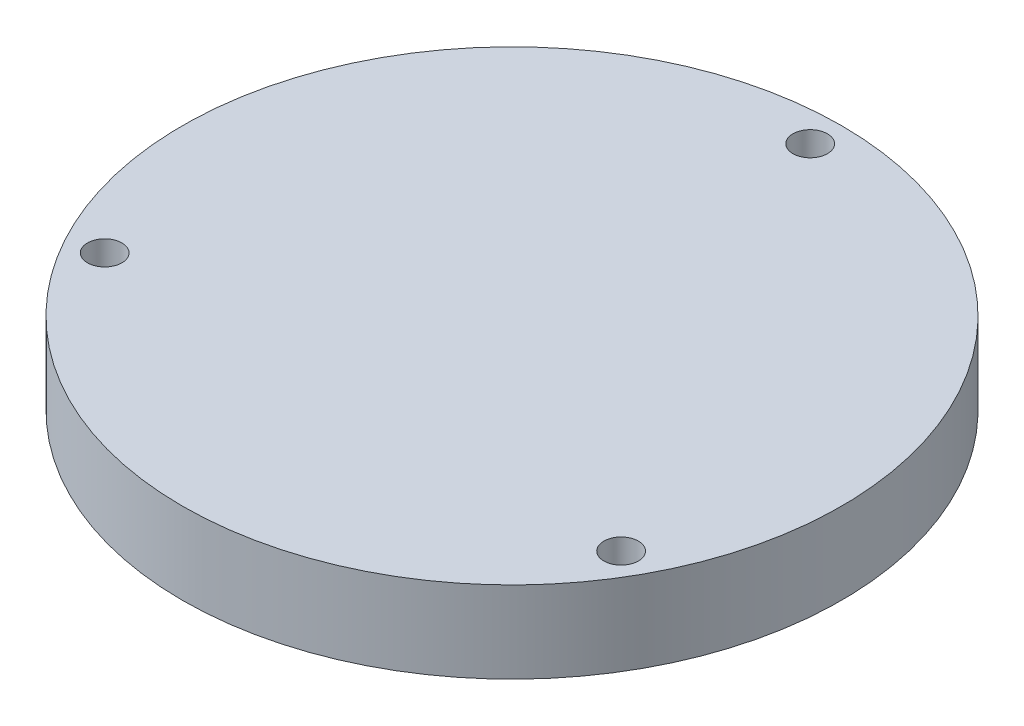
ISO-10303-21;
HEADER;
FILE_DESCRIPTION(('STEP AP214'),'2;1');
FILE_NAME('part.step','',(''),(''),'','','');
FILE_SCHEMA(('AUTOMOTIVE_DESIGN { 1 0 10303 214 1 1 1 1 }'));
ENDSEC;
DATA;
#1=APPLICATION_CONTEXT('core data for automotive mechanical design processes');
#2=APPLICATION_PROTOCOL_DEFINITION('international standard','automotive_design',2000,#1);
#3=PRODUCT_CONTEXT('',#1,'mechanical');
#4=PRODUCT('Part','Part','',(#3));
#5=PRODUCT_RELATED_PRODUCT_CATEGORY('part','',(#4));
#6=PRODUCT_DEFINITION_FORMATION('','',#4);
#7=PRODUCT_DEFINITION_CONTEXT('part definition',#1,'design');
#8=PRODUCT_DEFINITION('design','',#6,#7);
#9=PRODUCT_DEFINITION_SHAPE('','',#8);
#10=(LENGTH_UNIT() NAMED_UNIT(*) SI_UNIT(.MILLI.,.METRE.));
#11=(NAMED_UNIT(*) PLANE_ANGLE_UNIT() SI_UNIT($,.RADIAN.));
#12=(NAMED_UNIT(*) SI_UNIT($,.STERADIAN.) SOLID_ANGLE_UNIT());
#13=UNCERTAINTY_MEASURE_WITH_UNIT(LENGTH_MEASURE(1.E-05),#10,'distance_accuracy_value','');
#14=(GEOMETRIC_REPRESENTATION_CONTEXT(3) GLOBAL_UNCERTAINTY_ASSIGNED_CONTEXT((#13)) GLOBAL_UNIT_ASSIGNED_CONTEXT((#10,
#11,#12)) REPRESENTATION_CONTEXT('',''));
#15=CARTESIAN_POINT('',(0.,0.,0.));
#16=DIRECTION('',(0.,0.,1.));
#17=DIRECTION('',(1.,0.,0.));
#18=AXIS2_PLACEMENT_3D('',#15,#16,#17);
#19=CARTESIAN_POINT('',(-38.6795813318704,10.,29.2598699243729));
#20=DIRECTION('',(0.,-1.,0.));
#21=DIRECTION('',(0.,0.,-1.));
#22=AXIS2_PLACEMENT_3D('',#19,#20,#21);
#23=CYLINDRICAL_SURFACE('',#22,2.);
#24=CARTESIAN_POINT('',(-38.6795813318704,0.,29.2598699243729));
#25=DIRECTION('',(0.,1.,0.));
#26=DIRECTION('',(0.,0.,1.));
#27=AXIS2_PLACEMENT_3D('',#24,#25,#26);
#28=CIRCLE('',#27,2.);
#29=CARTESIAN_POINT('',(-39.6795813318704,0.,27.5278191168041));
#30=VERTEX_POINT('',#29);
#31=CARTESIAN_POINT('',(-40.274615613597,0.,30.4664624985739));
#32=VERTEX_POINT('',#31);
#33=EDGE_CURVE('E202',#30,#32,#28,.T.);
#34=ORIENTED_EDGE('',*,*,#33,.F.);
#35=DIRECTION('',(0.,-1.,0.));
#36=VECTOR('',#35,1.);
#37=CARTESIAN_POINT('',(-39.6795813318704,10.,27.5278191168041));
#38=LINE('',#37,#36);
#39=CARTESIAN_POINT('',(-39.6795813318704,10.,27.5278191168041));
#40=VERTEX_POINT('',#39);
#41=EDGE_CURVE('E11',#40,#30,#38,.T.);
#42=ORIENTED_EDGE('',*,*,#41,.F.);
#43=CARTESIAN_POINT('',(-38.6795813318704,10.,29.2598699243729));
#44=DIRECTION('',(0.,1.,0.));
#45=DIRECTION('',(0.,0.,1.));
#46=AXIS2_PLACEMENT_3D('',#43,#44,#45);
#47=CIRCLE('',#46,2.);
#48=CARTESIAN_POINT('',(-40.274615613597,10.,30.4664624985739));
#49=VERTEX_POINT('',#48);
#50=EDGE_CURVE('E249',#40,#49,#47,.T.);
#51=ORIENTED_EDGE('',*,*,#50,.T.);
#52=DIRECTION('',(0.,-1.,0.));
#53=VECTOR('',#52,1.);
#54=CARTESIAN_POINT('',(-40.274615613597,10.,30.4664624985739));
#55=LINE('',#54,#53);
#56=EDGE_CURVE('E117',#49,#32,#55,.T.);
#57=ORIENTED_EDGE('',*,*,#56,.T.);
#58=EDGE_LOOP('',(#34,#42,#51,#57));
#59=FACE_BOUND('',#58,.T.);
#60=ADVANCED_FACE('F36',(#59),#23,.F.);
#61=CARTESIAN_POINT('',(2.00000000000007,10.,3.46410161513791));
#62=DIRECTION('',(-0.499999999999997,0.,-0.86602540378444));
#63=DIRECTION('',(-0.86602540378444,0.,0.499999999999997));
#64=AXIS2_PLACEMENT_3D('',#61,#62,#63);
#65=PLANE('',#64);
#66=DIRECTION('',(0.86602540378444,0.,-0.499999999999997));
#67=VECTOR('',#66,1.);
#68=CARTESIAN_POINT('',(2.00000000000007,0.,3.46410161513791));
#69=LINE('',#68,#67);
#70=CARTESIAN_POINT('',(-39.1362066797609,0.,27.2141016151376));
#71=VERTEX_POINT('',#70);
#72=EDGE_CURVE('E205',#30,#71,#69,.T.);
#73=ORIENTED_EDGE('',*,*,#72,.T.);
#74=DIRECTION('',(0.,-1.,0.));
#75=VECTOR('',#74,1.);
#76=CARTESIAN_POINT('',(-39.1362066797609,10.,27.2141016151376));
#77=LINE('',#76,#75);
#78=CARTESIAN_POINT('',(-39.1362066797609,10.,27.2141016151376));
#79=VERTEX_POINT('',#78);
#80=EDGE_CURVE('E45',#79,#71,#77,.T.);
#81=ORIENTED_EDGE('',*,*,#80,.F.);
#82=DIRECTION('',(0.86602540378444,0.,-0.499999999999997));
#83=VECTOR('',#82,1.);
#84=CARTESIAN_POINT('',(2.00000000000007,10.,3.46410161513791));
#85=LINE('',#84,#83);
#86=EDGE_CURVE('E306',#40,#79,#85,.T.);
#87=ORIENTED_EDGE('',*,*,#86,.F.);
#88=ORIENTED_EDGE('',*,*,#41,.T.);
#89=EDGE_LOOP('',(#73,#81,#87,#88));
#90=FACE_BOUND('',#89,.T.);
#91=ADVANCED_FACE('F364',(#90),#65,.F.);
#92=CARTESIAN_POINT('',(-41.1362066797611,10.,23.7499999999996));
#93=DIRECTION('',(0.,-1.,0.));
#94=DIRECTION('',(0.,0.,-1.));
#95=AXIS2_PLACEMENT_3D('',#92,#93,#94);
#96=CYLINDRICAL_SURFACE('',#95,4.);
#97=CARTESIAN_POINT('',(-41.1362066797611,0.,23.7499999999996));
#98=DIRECTION('',(0.,1.,0.));
#99=DIRECTION('',(0.,0.,1.));
#100=AXIS2_PLACEMENT_3D('',#97,#98,#99);
#101=CIRCLE('',#100,4.);
#102=CARTESIAN_POINT('',(-43.1362066797609,0.,20.2858983848621));
#103=VERTEX_POINT('',#102);
#104=EDGE_CURVE('E208',#71,#103,#101,.T.);
#105=ORIENTED_EDGE('',*,*,#104,.T.);
#106=DIRECTION('',(0.,-1.,0.));
#107=VECTOR('',#106,1.);
#108=CARTESIAN_POINT('',(-43.1362066797609,10.,20.2858983848621));
#109=LINE('',#108,#107);
#110=CARTESIAN_POINT('',(-43.1362066797609,10.,20.2858983848621));
#111=VERTEX_POINT('',#110);
#112=EDGE_CURVE('E277',#111,#103,#109,.T.);
#113=ORIENTED_EDGE('',*,*,#112,.F.);
#114=CARTESIAN_POINT('',(-41.1362066797611,10.,23.7499999999996));
#115=DIRECTION('',(0.,1.,0.));
#116=DIRECTION('',(0.,0.,1.));
#117=AXIS2_PLACEMENT_3D('',#114,#115,#116);
#118=CIRCLE('',#117,4.);
#119=EDGE_CURVE('E309',#79,#111,#118,.T.);
#120=ORIENTED_EDGE('',*,*,#119,.F.);
#121=ORIENTED_EDGE('',*,*,#80,.T.);
#122=EDGE_LOOP('',(#105,#113,#120,#121));
#123=FACE_BOUND('',#122,.T.);
#124=ADVANCED_FACE('F368',(#123),#96,.T.);
#125=CARTESIAN_POINT('',(-1.9999999999999,10.,-3.46410161513761));
#126=DIRECTION('',(-0.499999999999997,0.,-0.86602540378444));
#127=DIRECTION('',(-0.86602540378444,0.,0.499999999999997));
#128=AXIS2_PLACEMENT_3D('',#125,#126,#127);
#129=PLANE('',#128);
#130=DIRECTION('',(0.86602540378444,0.,-0.499999999999997));
#131=VECTOR('',#130,1.);
#132=CARTESIAN_POINT('',(-1.9999999999999,0.,-3.46410161513761));
#133=LINE('',#132,#131);
#134=CARTESIAN_POINT('',(-43.6795813318704,0.,20.5996158865285));
#135=VERTEX_POINT('',#134);
#136=EDGE_CURVE('E211',#135,#103,#133,.T.);
#137=ORIENTED_EDGE('',*,*,#136,.F.);
#138=DIRECTION('',(0.,-1.,0.));
#139=VECTOR('',#138,1.);
#140=CARTESIAN_POINT('',(-43.6795813318704,10.,20.5996158865285));
#141=LINE('',#140,#139);
#142=CARTESIAN_POINT('',(-43.6795813318704,10.,20.5996158865285));
#143=VERTEX_POINT('',#142);
#144=EDGE_CURVE('E275',#143,#135,#141,.T.);
#145=ORIENTED_EDGE('',*,*,#144,.F.);
#146=DIRECTION('',(0.86602540378444,0.,-0.499999999999997));
#147=VECTOR('',#146,1.);
#148=CARTESIAN_POINT('',(-1.9999999999999,10.,-3.46410161513761));
#149=LINE('',#148,#147);
#150=EDGE_CURVE('E312',#143,#111,#149,.T.);
#151=ORIENTED_EDGE('',*,*,#150,.T.);
#152=ORIENTED_EDGE('',*,*,#112,.T.);
#153=EDGE_LOOP('',(#137,#145,#151,#152));
#154=FACE_BOUND('',#153,.T.);
#155=ADVANCED_FACE('F634',(#154),#129,.T.);
#156=CARTESIAN_POINT('',(-44.6795813318704,10.,18.8675650789597));
#157=DIRECTION('',(0.,-1.,0.));
#158=DIRECTION('',(0.,0.,-1.));
#159=AXIS2_PLACEMENT_3D('',#156,#157,#158);
#160=CYLINDRICAL_SURFACE('',#159,2.);
#161=CARTESIAN_POINT('',(-44.6795813318704,0.,18.8675650789597));
#162=DIRECTION('',(0.,1.,0.));
#163=DIRECTION('',(0.,0.,1.));
#164=AXIS2_PLACEMENT_3D('',#161,#162,#163);
#165=CIRCLE('',#164,2.);
#166=CARTESIAN_POINT('',(-46.5220382940094,0.,19.6456089997415));
#167=VERTEX_POINT('',#166);
#168=EDGE_CURVE('E214',#135,#167,#165,.F.);
#169=ORIENTED_EDGE('',*,*,#168,.T.);
#170=DIRECTION('',(0.,-1.,0.));
#171=VECTOR('',#170,1.);
#172=CARTESIAN_POINT('',(-46.5220382940094,10.,19.6456089997415));
#173=LINE('',#172,#171);
#174=CARTESIAN_POINT('',(-46.5220382940094,10.,19.6456089997415));
#175=VERTEX_POINT('',#174);
#176=EDGE_CURVE('E272',#175,#167,#173,.T.);
#177=ORIENTED_EDGE('',*,*,#176,.F.);
#178=CARTESIAN_POINT('',(-44.6795813318704,10.,18.8675650789597));
#179=DIRECTION('',(0.,1.,0.));
#180=DIRECTION('',(0.,0.,1.));
#181=AXIS2_PLACEMENT_3D('',#178,#179,#180);
#182=CIRCLE('',#181,2.);
#183=EDGE_CURVE('E315',#143,#175,#182,.F.);
#184=ORIENTED_EDGE('',*,*,#183,.F.);
#185=ORIENTED_EDGE('',*,*,#144,.T.);
#186=EDGE_LOOP('',(#169,#177,#184,#185));
#187=FACE_BOUND('',#186,.T.);
#188=ADVANCED_FACE('F623',(#187),#160,.F.);
#189=CARTESIAN_POINT('',(0.,10.,0.));
#190=DIRECTION('',(0.,-1.,0.));
#191=DIRECTION('',(0.,0.,-1.));
#192=AXIS2_PLACEMENT_3D('',#189,#190,#191);
#193=CYLINDRICAL_SURFACE('',#192,50.5);
#194=CARTESIAN_POINT('',(0.,0.,0.));
#195=DIRECTION('',(0.,1.,0.));
#196=DIRECTION('',(0.,0.,1.));
#197=AXIS2_PLACEMENT_3D('',#194,#195,#196);
#198=CIRCLE('',#197,50.5);
#199=CARTESIAN_POINT('',(-6.24742268041235,0.,-50.1120714983154));
#200=VERTEX_POINT('',#199);
#201=EDGE_CURVE('E216',#167,#200,#198,.F.);
#202=ORIENTED_EDGE('',*,*,#201,.T.);
#203=DIRECTION('',(0.,-1.,0.));
#204=VECTOR('',#203,1.);
#205=CARTESIAN_POINT('',(-6.24742268041235,10.,-50.1120714983154));
#206=LINE('',#205,#204);
#207=CARTESIAN_POINT('',(-6.24742268041235,10.,-50.1120714983154));
#208=VERTEX_POINT('',#207);
#209=EDGE_CURVE('E270',#208,#200,#206,.T.);
#210=ORIENTED_EDGE('',*,*,#209,.F.);
#211=CARTESIAN_POINT('',(0.,10.,0.));
#212=DIRECTION('',(0.,1.,0.));
#213=DIRECTION('',(0.,0.,1.));
#214=AXIS2_PLACEMENT_3D('',#211,#212,#213);
#215=CIRCLE('',#214,50.5);
#216=EDGE_CURVE('E318',#175,#208,#215,.F.);
#217=ORIENTED_EDGE('',*,*,#216,.F.);
#218=ORIENTED_EDGE('',*,*,#176,.T.);
#219=EDGE_LOOP('',(#202,#210,#217,#218));
#220=FACE_BOUND('',#219,.T.);
#221=ADVANCED_FACE('F613',(#220),#193,.F.);
#222=CARTESIAN_POINT('',(-6.,10.,-48.1274350033326));
#223=DIRECTION('',(0.,-1.,0.));
#224=DIRECTION('',(0.,0.,-1.));
#225=AXIS2_PLACEMENT_3D('',#222,#223,#224);
#226=CYLINDRICAL_SURFACE('',#225,2.);
#227=CARTESIAN_POINT('',(-6.,0.,-48.1274350033326));
#228=DIRECTION('',(0.,1.,0.));
#229=DIRECTION('',(0.,0.,1.));
#230=AXIS2_PLACEMENT_3D('',#227,#228,#229);
#231=CIRCLE('',#230,2.);
#232=CARTESIAN_POINT('',(-4.,0.,-48.1274350033326));
#233=VERTEX_POINT('',#232);
#234=EDGE_CURVE('E219',#233,#200,#231,.T.);
#235=ORIENTED_EDGE('',*,*,#234,.F.);
#236=DIRECTION('',(0.,-1.,0.));
#237=VECTOR('',#236,1.);
#238=CARTESIAN_POINT('',(-4.,10.,-48.1274350033326));
#239=LINE('',#238,#237);
#240=CARTESIAN_POINT('',(-4.,10.,-48.1274350033326));
#241=VERTEX_POINT('',#240);
#242=EDGE_CURVE('E268',#241,#233,#239,.T.);
#243=ORIENTED_EDGE('',*,*,#242,.F.);
#244=CARTESIAN_POINT('',(-6.,10.,-48.1274350033326));
#245=DIRECTION('',(0.,1.,0.));
#246=DIRECTION('',(0.,0.,1.));
#247=AXIS2_PLACEMENT_3D('',#244,#245,#246);
#248=CIRCLE('',#247,2.);
#249=EDGE_CURVE('E321',#241,#208,#248,.T.);
#250=ORIENTED_EDGE('',*,*,#249,.T.);
#251=ORIENTED_EDGE('',*,*,#209,.T.);
#252=EDGE_LOOP('',(#235,#243,#250,#251));
#253=FACE_BOUND('',#252,.T.);
#254=ADVANCED_FACE('F603',(#253),#226,.F.);
#255=CARTESIAN_POINT('',(-4.,10.,0.));
#256=DIRECTION('',(1.,0.,0.));
#257=DIRECTION('',(0.,0.,-1.));
#258=AXIS2_PLACEMENT_3D('',#255,#256,#257);
#259=PLANE('',#258);
#260=DIRECTION('',(0.,0.,1.));
#261=VECTOR('',#260,1.);
#262=CARTESIAN_POINT('',(-4.,0.,0.));
#263=LINE('',#262,#261);
#264=CARTESIAN_POINT('',(-4.,0.,-47.5));
#265=VERTEX_POINT('',#264);
#266=EDGE_CURVE('E222',#233,#265,#263,.T.);
#267=ORIENTED_EDGE('',*,*,#266,.T.);
#268=DIRECTION('',(0.,-1.,0.));
#269=VECTOR('',#268,1.);
#270=CARTESIAN_POINT('',(-4.,10.,-47.5));
#271=LINE('',#270,#269);
#272=CARTESIAN_POINT('',(-4.,10.,-47.5));
#273=VERTEX_POINT('',#272);
#274=EDGE_CURVE('E265',#273,#265,#271,.T.);
#275=ORIENTED_EDGE('',*,*,#274,.F.);
#276=DIRECTION('',(0.,0.,1.));
#277=VECTOR('',#276,1.);
#278=CARTESIAN_POINT('',(-4.,10.,0.));
#279=LINE('',#278,#277);
#280=EDGE_CURVE('E324',#241,#273,#279,.T.);
#281=ORIENTED_EDGE('',*,*,#280,.F.);
#282=ORIENTED_EDGE('',*,*,#242,.T.);
#283=EDGE_LOOP('',(#267,#275,#281,#282));
#284=FACE_BOUND('',#283,.T.);
#285=ADVANCED_FACE('F593',(#284),#259,.F.);
#286=CARTESIAN_POINT('',(0.,10.,-47.5));
#287=DIRECTION('',(0.,-1.,0.));
#288=DIRECTION('',(0.,0.,-1.));
#289=AXIS2_PLACEMENT_3D('',#286,#287,#288);
#290=CYLINDRICAL_SURFACE('',#289,4.);
#291=CARTESIAN_POINT('',(0.,0.,-47.5));
#292=DIRECTION('',(0.,1.,0.));
#293=DIRECTION('',(0.,0.,1.));
#294=AXIS2_PLACEMENT_3D('',#291,#292,#293);
#295=CIRCLE('',#294,4.);
#296=CARTESIAN_POINT('',(4.,0.,-47.5));
#297=VERTEX_POINT('',#296);
#298=EDGE_CURVE('E224',#265,#297,#295,.T.);
#299=ORIENTED_EDGE('',*,*,#298,.T.);
#300=DIRECTION('',(0.,-1.,0.));
#301=VECTOR('',#300,1.);
#302=CARTESIAN_POINT('',(4.,10.,-47.5));
#303=LINE('',#302,#301);
#304=CARTESIAN_POINT('',(4.,10.,-47.5));
#305=VERTEX_POINT('',#304);
#306=EDGE_CURVE('E263',#305,#297,#303,.T.);
#307=ORIENTED_EDGE('',*,*,#306,.F.);
#308=CARTESIAN_POINT('',(0.,10.,-47.5));
#309=DIRECTION('',(0.,1.,0.));
#310=DIRECTION('',(0.,0.,1.));
#311=AXIS2_PLACEMENT_3D('',#308,#309,#310);
#312=CIRCLE('',#311,4.);
#313=EDGE_CURVE('E327',#273,#305,#312,.T.);
#314=ORIENTED_EDGE('',*,*,#313,.F.);
#315=ORIENTED_EDGE('',*,*,#274,.T.);
#316=EDGE_LOOP('',(#299,#307,#314,#315));
#317=FACE_BOUND('',#316,.T.);
#318=ADVANCED_FACE('F583',(#317),#290,.T.);
#319=CARTESIAN_POINT('',(4.,10.,0.));
#320=DIRECTION('',(1.,0.,0.));
#321=DIRECTION('',(0.,0.,-1.));
#322=AXIS2_PLACEMENT_3D('',#319,#320,#321);
#323=PLANE('',#322);
#324=DIRECTION('',(0.,0.,1.));
#325=VECTOR('',#324,1.);
#326=CARTESIAN_POINT('',(4.,0.,0.));
#327=LINE('',#326,#325);
#328=CARTESIAN_POINT('',(4.,0.,-48.1274350033326));
#329=VERTEX_POINT('',#328);
#330=EDGE_CURVE('E227',#329,#297,#327,.T.);
#331=ORIENTED_EDGE('',*,*,#330,.F.);
#332=DIRECTION('',(0.,-1.,0.));
#333=VECTOR('',#332,1.);
#334=CARTESIAN_POINT('',(4.,10.,-48.1274350033326));
#335=LINE('',#334,#333);
#336=CARTESIAN_POINT('',(4.,10.,-48.1274350033326));
#337=VERTEX_POINT('',#336);
#338=EDGE_CURVE('E261',#337,#329,#335,.T.);
#339=ORIENTED_EDGE('',*,*,#338,.F.);
#340=DIRECTION('',(0.,0.,1.));
#341=VECTOR('',#340,1.);
#342=CARTESIAN_POINT('',(4.,10.,0.));
#343=LINE('',#342,#341);
#344=EDGE_CURVE('E330',#337,#305,#343,.T.);
#345=ORIENTED_EDGE('',*,*,#344,.T.);
#346=ORIENTED_EDGE('',*,*,#306,.T.);
#347=EDGE_LOOP('',(#331,#339,#345,#346));
#348=FACE_BOUND('',#347,.T.);
#349=ADVANCED_FACE('F573',(#348),#323,.T.);
#350=CARTESIAN_POINT('',(6.,10.,-48.1274350033326));
#351=DIRECTION('',(0.,-1.,0.));
#352=DIRECTION('',(0.,0.,-1.));
#353=AXIS2_PLACEMENT_3D('',#350,#351,#352);
#354=CYLINDRICAL_SURFACE('',#353,2.);
#355=CARTESIAN_POINT('',(6.,0.,-48.1274350033326));
#356=DIRECTION('',(0.,1.,0.));
#357=DIRECTION('',(0.,0.,1.));
#358=AXIS2_PLACEMENT_3D('',#355,#356,#357);
#359=CIRCLE('',#358,2.);
#360=CARTESIAN_POINT('',(6.24742268041237,0.,-50.1120714983154));
#361=VERTEX_POINT('',#360);
#362=EDGE_CURVE('E230',#329,#361,#359,.F.);
#363=ORIENTED_EDGE('',*,*,#362,.T.);
#364=DIRECTION('',(0.,-1.,0.));
#365=VECTOR('',#364,1.);
#366=CARTESIAN_POINT('',(6.24742268041237,10.,-50.1120714983154));
#367=LINE('',#366,#365);
#368=CARTESIAN_POINT('',(6.24742268041237,10.,-50.1120714983154));
#369=VERTEX_POINT('',#368);
#370=EDGE_CURVE('E258',#369,#361,#367,.T.);
#371=ORIENTED_EDGE('',*,*,#370,.F.);
#372=CARTESIAN_POINT('',(6.,10.,-48.1274350033326));
#373=DIRECTION('',(0.,1.,0.));
#374=DIRECTION('',(0.,0.,1.));
#375=AXIS2_PLACEMENT_3D('',#372,#373,#374);
#376=CIRCLE('',#375,2.);
#377=EDGE_CURVE('E333',#337,#369,#376,.F.);
#378=ORIENTED_EDGE('',*,*,#377,.F.);
#379=ORIENTED_EDGE('',*,*,#338,.T.);
#380=EDGE_LOOP('',(#363,#371,#378,#379));
#381=FACE_BOUND('',#380,.T.);
#382=ADVANCED_FACE('F563',(#381),#354,.F.);
#383=CARTESIAN_POINT('',(0.,10.,0.));
#384=DIRECTION('',(0.,-1.,0.));
#385=DIRECTION('',(0.,0.,-1.));
#386=AXIS2_PLACEMENT_3D('',#383,#384,#385);
#387=CYLINDRICAL_SURFACE('',#386,50.5);
#388=CARTESIAN_POINT('',(0.,0.,0.));
#389=DIRECTION('',(0.,1.,0.));
#390=DIRECTION('',(0.,0.,1.));
#391=AXIS2_PLACEMENT_3D('',#388,#389,#390);
#392=CIRCLE('',#391,50.5);
#393=CARTESIAN_POINT('',(46.5220382940094,0.,19.6456089997415));
#394=VERTEX_POINT('',#393);
#395=EDGE_CURVE('E232',#361,#394,#392,.F.);
#396=ORIENTED_EDGE('',*,*,#395,.T.);
#397=DIRECTION('',(0.,-1.,0.));
#398=VECTOR('',#397,1.);
#399=CARTESIAN_POINT('',(46.5220382940094,10.,19.6456089997415));
#400=LINE('',#399,#398);
#401=CARTESIAN_POINT('',(46.5220382940094,10.,19.6456089997415));
#402=VERTEX_POINT('',#401);
#403=EDGE_CURVE('E256',#402,#394,#400,.T.);
#404=ORIENTED_EDGE('',*,*,#403,.F.);
#405=CARTESIAN_POINT('',(0.,10.,0.));
#406=DIRECTION('',(0.,1.,0.));
#407=DIRECTION('',(0.,0.,1.));
#408=AXIS2_PLACEMENT_3D('',#405,#406,#407);
#409=CIRCLE('',#408,50.5);
#410=EDGE_CURVE('E336',#369,#402,#409,.F.);
#411=ORIENTED_EDGE('',*,*,#410,.F.);
#412=ORIENTED_EDGE('',*,*,#370,.T.);
#413=EDGE_LOOP('',(#396,#404,#411,#412));
#414=FACE_BOUND('',#413,.T.);
#415=ADVANCED_FACE('F346',(#414),#387,.F.);
#416=CARTESIAN_POINT('',(44.6795813318704,10.,18.8675650789596));
#417=DIRECTION('',(0.,-1.,0.));
#418=DIRECTION('',(0.,0.,-1.));
#419=AXIS2_PLACEMENT_3D('',#416,#417,#418);
#420=CYLINDRICAL_SURFACE('',#419,2.00000000000001);
#421=CARTESIAN_POINT('',(44.6795813318704,0.,18.8675650789596));
#422=DIRECTION('',(0.,1.,0.));
#423=DIRECTION('',(0.,0.,1.));
#424=AXIS2_PLACEMENT_3D('',#421,#422,#423);
#425=CIRCLE('',#424,2.00000000000001);
#426=CARTESIAN_POINT('',(43.6795813318704,0.,20.5996158865285));
#427=VERTEX_POINT('',#426);
#428=EDGE_CURVE('E235',#427,#394,#425,.T.);
#429=ORIENTED_EDGE('',*,*,#428,.F.);
#430=DIRECTION('',(0.,-1.,0.));
#431=VECTOR('',#430,1.);
#432=CARTESIAN_POINT('',(43.6795813318704,10.,20.5996158865285));
#433=LINE('',#432,#431);
#434=CARTESIAN_POINT('',(43.6795813318704,10.,20.5996158865285));
#435=VERTEX_POINT('',#434);
#436=EDGE_CURVE('E254',#435,#427,#433,.T.);
#437=ORIENTED_EDGE('',*,*,#436,.F.);
#438=CARTESIAN_POINT('',(44.6795813318704,10.,18.8675650789596));
#439=DIRECTION('',(0.,1.,0.));
#440=DIRECTION('',(0.,0.,1.));
#441=AXIS2_PLACEMENT_3D('',#438,#439,#440);
#442=CIRCLE('',#441,2.00000000000001);
#443=EDGE_CURVE('E194',#435,#402,#442,.T.);
#444=ORIENTED_EDGE('',*,*,#443,.T.);
#445=ORIENTED_EDGE('',*,*,#403,.T.);
#446=EDGE_LOOP('',(#429,#437,#444,#445));
#447=FACE_BOUND('',#446,.T.);
#448=ADVANCED_FACE('F341',(#447),#420,.F.);
#449=CARTESIAN_POINT('',(2.00000000000021,10.,-3.46410161513805));
#450=DIRECTION('',(-0.500000000000006,0.,0.866025403784435));
#451=DIRECTION('',(0.866025403784435,0.,0.500000000000006));
#452=AXIS2_PLACEMENT_3D('',#449,#450,#451);
#453=PLANE('',#452);
#454=DIRECTION('',(-0.866025403784435,0.,-0.500000000000006));
#455=VECTOR('',#454,1.);
#456=CARTESIAN_POINT('',(2.00000000000021,0.,-3.46410161513805));
#457=LINE('',#456,#455);
#458=CARTESIAN_POINT('',(43.1362066797608,0.,20.2858983848623));
#459=VERTEX_POINT('',#458);
#460=EDGE_CURVE('E238',#427,#459,#457,.T.);
#461=ORIENTED_EDGE('',*,*,#460,.T.);
#462=DIRECTION('',(0.,-1.,0.));
#463=VECTOR('',#462,1.);
#464=CARTESIAN_POINT('',(43.1362066797608,10.,20.2858983848623));
#465=LINE('',#464,#463);
#466=CARTESIAN_POINT('',(43.1362066797608,10.,20.2858983848623));
#467=VERTEX_POINT('',#466);
#468=EDGE_CURVE('E178',#467,#459,#465,.T.);
#469=ORIENTED_EDGE('',*,*,#468,.F.);
#470=DIRECTION('',(-0.866025403784435,0.,-0.500000000000006));
#471=VECTOR('',#470,1.);
#472=CARTESIAN_POINT('',(2.00000000000021,10.,-3.46410161513805));
#473=LINE('',#472,#471);
#474=EDGE_CURVE('E192',#435,#467,#473,.T.);
#475=ORIENTED_EDGE('',*,*,#474,.F.);
#476=ORIENTED_EDGE('',*,*,#436,.T.);
#477=EDGE_LOOP('',(#461,#469,#475,#476));
#478=FACE_BOUND('',#477,.T.);
#479=ADVANCED_FACE('F354',(#478),#453,.F.);
#480=CARTESIAN_POINT('',(41.1362066797607,10.,23.7500000000002));
#481=DIRECTION('',(0.,-1.,0.));
#482=DIRECTION('',(0.,0.,-1.));
#483=AXIS2_PLACEMENT_3D('',#480,#481,#482);
#484=CYLINDRICAL_SURFACE('',#483,4.);
#485=CARTESIAN_POINT('',(41.1362066797607,0.,23.7500000000002));
#486=DIRECTION('',(0.,1.,0.));
#487=DIRECTION('',(0.,0.,1.));
#488=AXIS2_PLACEMENT_3D('',#485,#486,#487);
#489=CIRCLE('',#488,4.);
#490=CARTESIAN_POINT('',(39.1362066797608,0.,27.2141016151378));
#491=VERTEX_POINT('',#490);
#492=EDGE_CURVE('E174',#459,#491,#489,.T.);
#493=ORIENTED_EDGE('',*,*,#492,.T.);
#494=DIRECTION('',(0.,-1.,0.));
#495=VECTOR('',#494,1.);
#496=CARTESIAN_POINT('',(39.1362066797608,10.,27.2141016151378));
#497=LINE('',#496,#495);
#498=CARTESIAN_POINT('',(39.1362066797608,10.,27.2141016151378));
#499=VERTEX_POINT('',#498);
#500=EDGE_CURVE('E166',#499,#491,#497,.T.);
#501=ORIENTED_EDGE('',*,*,#500,.F.);
#502=CARTESIAN_POINT('',(41.1362066797607,10.,23.7500000000002));
#503=DIRECTION('',(0.,1.,0.));
#504=DIRECTION('',(0.,0.,1.));
#505=AXIS2_PLACEMENT_3D('',#502,#503,#504);
#506=CIRCLE('',#505,4.);
#507=EDGE_CURVE('E171',#467,#499,#506,.T.);
#508=ORIENTED_EDGE('',*,*,#507,.F.);
#509=ORIENTED_EDGE('',*,*,#468,.T.);
#510=EDGE_LOOP('',(#493,#501,#508,#509));
#511=FACE_BOUND('',#510,.T.);
#512=ADVANCED_FACE('F168',(#511),#484,.T.);
#513=CARTESIAN_POINT('',(-2.00000000000004,10.,3.46410161513785));
#514=DIRECTION('',(-0.499999999999998,0.,0.86602540378444));
#515=DIRECTION('',(0.86602540378444,0.,0.499999999999998));
#516=AXIS2_PLACEMENT_3D('',#513,#514,#515);
#517=PLANE('',#516);
#518=DIRECTION('',(-0.86602540378444,0.,-0.499999999999998));
#519=VECTOR('',#518,1.);
#520=CARTESIAN_POINT('',(-2.00000000000004,0.,3.46410161513785));
#521=LINE('',#520,#519);
#522=CARTESIAN_POINT('',(39.6795813318704,0.,27.527819116804));
#523=VERTEX_POINT('',#522);
#524=EDGE_CURVE('E241',#523,#491,#521,.T.);
#525=ORIENTED_EDGE('',*,*,#524,.F.);
#526=DIRECTION('',(0.,-1.,0.));
#527=VECTOR('',#526,1.);
#528=CARTESIAN_POINT('',(39.6795813318704,10.,27.527819116804));
#529=LINE('',#528,#527);
#530=CARTESIAN_POINT('',(39.6795813318704,10.,27.527819116804));
#531=VERTEX_POINT('',#530);
#532=EDGE_CURVE('E179',#531,#523,#529,.T.);
#533=ORIENTED_EDGE('',*,*,#532,.F.);
#534=DIRECTION('',(-0.86602540378444,0.,-0.499999999999998));
#535=VECTOR('',#534,1.);
#536=CARTESIAN_POINT('',(-2.00000000000004,10.,3.46410161513785));
#537=LINE('',#536,#535);
#538=EDGE_CURVE('E182',#531,#499,#537,.T.);
#539=ORIENTED_EDGE('',*,*,#538,.T.);
#540=ORIENTED_EDGE('',*,*,#500,.T.);
#541=EDGE_LOOP('',(#525,#533,#539,#540));
#542=FACE_BOUND('',#541,.T.);
#543=ADVANCED_FACE('F183',(#542),#517,.T.);
#544=CARTESIAN_POINT('',(38.6795813318704,10.,29.2598699243729));
#545=DIRECTION('',(0.,-1.,0.));
#546=DIRECTION('',(0.,0.,-1.));
#547=AXIS2_PLACEMENT_3D('',#544,#545,#546);
#548=CYLINDRICAL_SURFACE('',#547,1.99999999999999);
#549=CARTESIAN_POINT('',(38.6795813318704,0.,29.2598699243729));
#550=DIRECTION('',(0.,1.,0.));
#551=DIRECTION('',(0.,0.,1.));
#552=AXIS2_PLACEMENT_3D('',#549,#550,#551);
#553=CIRCLE('',#552,1.99999999999999);
#554=CARTESIAN_POINT('',(40.274615613597,0.,30.4664624985739));
#555=VERTEX_POINT('',#554);
#556=EDGE_CURVE('E110',#523,#555,#553,.F.);
#557=ORIENTED_EDGE('',*,*,#556,.T.);
#558=DIRECTION('',(0.,-1.,0.));
#559=VECTOR('',#558,1.);
#560=CARTESIAN_POINT('',(40.274615613597,10.,30.4664624985739));
#561=LINE('',#560,#559);
#562=CARTESIAN_POINT('',(40.274615613597,10.,30.4664624985739));
#563=VERTEX_POINT('',#562);
#564=EDGE_CURVE('E54',#563,#555,#561,.T.);
#565=ORIENTED_EDGE('',*,*,#564,.F.);
#566=CARTESIAN_POINT('',(38.6795813318704,10.,29.2598699243729));
#567=DIRECTION('',(0.,1.,0.));
#568=DIRECTION('',(0.,0.,1.));
#569=AXIS2_PLACEMENT_3D('',#566,#567,#568);
#570=CIRCLE('',#569,1.99999999999999);
#571=EDGE_CURVE('E186',#531,#563,#570,.F.);
#572=ORIENTED_EDGE('',*,*,#571,.F.);
#573=ORIENTED_EDGE('',*,*,#532,.T.);
#574=EDGE_LOOP('',(#557,#565,#572,#573));
#575=FACE_BOUND('',#574,.T.);
#576=ADVANCED_FACE('F378',(#575),#548,.F.);
#577=CARTESIAN_POINT('',(0.,10.,0.));
#578=DIRECTION('',(0.,-1.,0.));
#579=DIRECTION('',(0.,0.,-1.));
#580=AXIS2_PLACEMENT_3D('',#577,#578,#579);
#581=CYLINDRICAL_SURFACE('',#580,50.5);
#582=CARTESIAN_POINT('',(0.,0.,0.));
#583=DIRECTION('',(0.,1.,0.));
#584=DIRECTION('',(0.,0.,1.));
#585=AXIS2_PLACEMENT_3D('',#582,#583,#584);
#586=CIRCLE('',#585,50.5);
#587=EDGE_CURVE('E244',#555,#32,#586,.F.);
#588=ORIENTED_EDGE('',*,*,#587,.T.);
#589=ORIENTED_EDGE('',*,*,#56,.F.);
#590=CARTESIAN_POINT('',(0.,10.,0.));
#591=DIRECTION('',(0.,1.,0.));
#592=DIRECTION('',(0.,0.,1.));
#593=AXIS2_PLACEMENT_3D('',#590,#591,#592);
#594=CIRCLE('',#593,50.5);
#595=EDGE_CURVE('E199',#563,#49,#594,.F.);
#596=ORIENTED_EDGE('',*,*,#595,.F.);
#597=ORIENTED_EDGE('',*,*,#564,.T.);
#598=EDGE_LOOP('',(#588,#589,#596,#597));
#599=FACE_BOUND('',#598,.T.);
#600=ADVANCED_FACE('F377',(#599),#581,.F.);
#601=CARTESIAN_POINT('',(0.,10.,0.));
#602=DIRECTION('',(0.,-1.,0.));
#603=DIRECTION('',(0.,0.,-1.));
#604=AXIS2_PLACEMENT_3D('',#601,#602,#603);
#605=CYLINDRICAL_SURFACE('',#604,52.5);
#606=CARTESIAN_POINT('',(0.,0.,0.));
#607=DIRECTION('',(0.,1.,0.));
#608=DIRECTION('',(0.,0.,1.));
#609=AXIS2_PLACEMENT_3D('',#606,#607,#608);
#610=CIRCLE('',#609,52.5);
#611=CARTESIAN_POINT('',(0.,0.,52.5));
#612=VERTEX_POINT('',#611);
#613=EDGE_CURVE('E246',#612,#612,#610,.T.);
#614=ORIENTED_EDGE('',*,*,#613,.T.);
#615=EDGE_LOOP('',(#614));
#616=FACE_BOUND('',#615,.T.);
#617=CARTESIAN_POINT('',(0.,13.,0.));
#618=DIRECTION('',(0.,1.,0.));
#619=DIRECTION('',(0.,0.,1.));
#620=AXIS2_PLACEMENT_3D('',#617,#618,#619);
#621=CIRCLE('',#620,52.5);
#622=CARTESIAN_POINT('',(0.,13.,52.5));
#623=VERTEX_POINT('',#622);
#624=EDGE_CURVE('E206',#623,#623,#621,.T.);
#625=ORIENTED_EDGE('',*,*,#624,.F.);
#626=EDGE_LOOP('',(#625));
#627=FACE_BOUND('',#626,.T.);
#628=ADVANCED_FACE('F385',(#616,#627),#605,.T.);
#629=CARTESIAN_POINT('',(0.,0.,0.));
#630=DIRECTION('',(0.,1.,0.));
#631=DIRECTION('',(0.,0.,1.));
#632=AXIS2_PLACEMENT_3D('',#629,#630,#631);
#633=PLANE('',#632);
#634=CARTESIAN_POINT('',(0.,0.,-47.5));
#635=DIRECTION('',(0.,-1.,0.));
#636=DIRECTION('',(0.,0.,-1.));
#637=AXIS2_PLACEMENT_3D('',#634,#635,#636);
#638=CIRCLE('',#637,1.55);
#639=CARTESIAN_POINT('',(0.,0.,-49.05));
#640=VERTEX_POINT('',#639);
#641=EDGE_CURVE('E284',#640,#640,#638,.T.);
#642=ORIENTED_EDGE('',*,*,#641,.F.);
#643=EDGE_LOOP('',(#642));
#644=FACE_BOUND('',#643,.T.);
#645=CARTESIAN_POINT('',(-41.1362066797608,0.,23.75));
#646=DIRECTION('',(0.,-1.,0.));
#647=DIRECTION('',(0.,0.,-1.));
#648=AXIS2_PLACEMENT_3D('',#645,#646,#647);
#649=CIRCLE('',#648,1.55);
#650=CARTESIAN_POINT('',(-41.1362066797608,0.,22.2));
#651=VERTEX_POINT('',#650);
#652=EDGE_CURVE('E439',#651,#651,#649,.T.);
#653=ORIENTED_EDGE('',*,*,#652,.F.);
#654=EDGE_LOOP('',(#653));
#655=FACE_BOUND('',#654,.T.);
#656=CARTESIAN_POINT('',(41.1362066797608,0.,23.75));
#657=DIRECTION('',(0.,-1.,0.));
#658=DIRECTION('',(0.,0.,-1.));
#659=AXIS2_PLACEMENT_3D('',#656,#657,#658);
#660=CIRCLE('',#659,1.55);
#661=CARTESIAN_POINT('',(41.1362066797608,0.,22.2));
#662=VERTEX_POINT('',#661);
#663=EDGE_CURVE('E442',#662,#662,#660,.T.);
#664=ORIENTED_EDGE('',*,*,#663,.F.);
#665=EDGE_LOOP('',(#664));
#666=FACE_BOUND('',#665,.T.);
#667=ORIENTED_EDGE('',*,*,#33,.T.);
#668=ORIENTED_EDGE('',*,*,#587,.F.);
#669=ORIENTED_EDGE('',*,*,#556,.F.);
#670=ORIENTED_EDGE('',*,*,#524,.T.);
#671=ORIENTED_EDGE('',*,*,#492,.F.);
#672=ORIENTED_EDGE('',*,*,#460,.F.);
#673=ORIENTED_EDGE('',*,*,#428,.T.);
#674=ORIENTED_EDGE('',*,*,#395,.F.);
#675=ORIENTED_EDGE('',*,*,#362,.F.);
#676=ORIENTED_EDGE('',*,*,#330,.T.);
#677=ORIENTED_EDGE('',*,*,#298,.F.);
#678=ORIENTED_EDGE('',*,*,#266,.F.);
#679=ORIENTED_EDGE('',*,*,#234,.T.);
#680=ORIENTED_EDGE('',*,*,#201,.F.);
#681=ORIENTED_EDGE('',*,*,#168,.F.);
#682=ORIENTED_EDGE('',*,*,#136,.T.);
#683=ORIENTED_EDGE('',*,*,#104,.F.);
#684=ORIENTED_EDGE('',*,*,#72,.F.);
#685=EDGE_LOOP('',(#667,#668,#669,#670,#671,#672,#673,#674,#675,#676,#677,#678,#679,#680,#681,
#682,#683,#684));
#686=FACE_BOUND('',#685,.T.);
#687=ORIENTED_EDGE('',*,*,#613,.F.);
#688=EDGE_LOOP('',(#687));
#689=FACE_BOUND('',#688,.T.);
#690=ADVANCED_FACE('F351',(#644,#655,#666,#686,#689),#633,.F.);
#691=CARTESIAN_POINT('',(0.,10.,0.));
#692=DIRECTION('',(0.,1.,0.));
#693=DIRECTION('',(0.,0.,1.));
#694=AXIS2_PLACEMENT_3D('',#691,#692,#693);
#695=PLANE('',#694);
#696=ORIENTED_EDGE('',*,*,#50,.F.);
#697=ORIENTED_EDGE('',*,*,#86,.T.);
#698=ORIENTED_EDGE('',*,*,#119,.T.);
#699=ORIENTED_EDGE('',*,*,#150,.F.);
#700=ORIENTED_EDGE('',*,*,#183,.T.);
#701=ORIENTED_EDGE('',*,*,#216,.T.);
#702=ORIENTED_EDGE('',*,*,#249,.F.);
#703=ORIENTED_EDGE('',*,*,#280,.T.);
#704=ORIENTED_EDGE('',*,*,#313,.T.);
#705=ORIENTED_EDGE('',*,*,#344,.F.);
#706=ORIENTED_EDGE('',*,*,#377,.T.);
#707=ORIENTED_EDGE('',*,*,#410,.T.);
#708=ORIENTED_EDGE('',*,*,#443,.F.);
#709=ORIENTED_EDGE('',*,*,#474,.T.);
#710=ORIENTED_EDGE('',*,*,#507,.T.);
#711=ORIENTED_EDGE('',*,*,#538,.F.);
#712=ORIENTED_EDGE('',*,*,#571,.T.);
#713=ORIENTED_EDGE('',*,*,#595,.T.);
#714=EDGE_LOOP('',(#696,#697,#698,#699,#700,#701,#702,#703,#704,#705,#706,#707,#708,#709,#710,
#711,#712,#713));
#715=FACE_BOUND('',#714,.T.);
#716=ADVANCED_FACE('F189',(#715),#695,.F.);
#717=CARTESIAN_POINT('',(0.,13.,0.));
#718=DIRECTION('',(0.,1.,0.));
#719=DIRECTION('',(0.,0.,1.));
#720=AXIS2_PLACEMENT_3D('',#717,#718,#719);
#721=PLANE('',#720);
#722=CARTESIAN_POINT('',(41.1362066797608,13.,23.75));
#723=DIRECTION('',(0.,-1.,0.));
#724=DIRECTION('',(0.,0.,-1.));
#725=AXIS2_PLACEMENT_3D('',#722,#723,#724);
#726=CIRCLE('',#725,2.75);
#727=CARTESIAN_POINT('',(41.1362066797608,13.,21.));
#728=VERTEX_POINT('',#727);
#729=EDGE_CURVE('E304',#728,#728,#726,.T.);
#730=ORIENTED_EDGE('',*,*,#729,.T.);
#731=EDGE_LOOP('',(#730));
#732=FACE_BOUND('',#731,.T.);
#733=CARTESIAN_POINT('',(-41.1362066797608,13.,23.75));
#734=DIRECTION('',(0.,-1.,0.));
#735=DIRECTION('',(0.,0.,-1.));
#736=AXIS2_PLACEMENT_3D('',#733,#734,#735);
#737=CIRCLE('',#736,2.75);
#738=CARTESIAN_POINT('',(-41.1362066797608,13.,21.));
#739=VERTEX_POINT('',#738);
#740=EDGE_CURVE('E298',#739,#739,#737,.T.);
#741=ORIENTED_EDGE('',*,*,#740,.T.);
#742=EDGE_LOOP('',(#741));
#743=FACE_BOUND('',#742,.T.);
#744=CARTESIAN_POINT('',(0.,13.,-47.5));
#745=DIRECTION('',(0.,-1.,0.));
#746=DIRECTION('',(0.,0.,-1.));
#747=AXIS2_PLACEMENT_3D('',#744,#745,#746);
#748=CIRCLE('',#747,2.75);
#749=CARTESIAN_POINT('',(0.,13.,-50.25));
#750=VERTEX_POINT('',#749);
#751=EDGE_CURVE('E289',#750,#750,#748,.T.);
#752=ORIENTED_EDGE('',*,*,#751,.T.);
#753=EDGE_LOOP('',(#752));
#754=FACE_BOUND('',#753,.T.);
#755=ORIENTED_EDGE('',*,*,#624,.T.);
#756=EDGE_LOOP('',(#755));
#757=FACE_BOUND('',#756,.T.);
#758=ADVANCED_FACE('F397',(#732,#743,#754,#757),#721,.T.);
#759=CARTESIAN_POINT('',(0.,13.,-47.5));
#760=DIRECTION('',(0.,-1.,0.));
#761=DIRECTION('',(0.,0.,-1.));
#762=AXIS2_PLACEMENT_3D('',#759,#760,#761);
#763=CYLINDRICAL_SURFACE('',#762,2.75);
#764=ORIENTED_EDGE('',*,*,#751,.F.);
#765=EDGE_LOOP('',(#764));
#766=FACE_BOUND('',#765,.T.);
#767=CARTESIAN_POINT('',(0.,3.,-47.5));
#768=DIRECTION('',(0.,-1.,0.));
#769=DIRECTION('',(0.,0.,-1.));
#770=AXIS2_PLACEMENT_3D('',#767,#768,#769);
#771=CIRCLE('',#770,2.75);
#772=CARTESIAN_POINT('',(0.,3.,-50.25));
#773=VERTEX_POINT('',#772);
#774=EDGE_CURVE('E293',#773,#773,#771,.T.);
#775=ORIENTED_EDGE('',*,*,#774,.T.);
#776=EDGE_LOOP('',(#775));
#777=FACE_BOUND('',#776,.T.);
#778=ADVANCED_FACE('F400',(#766,#777),#763,.F.);
#779=CARTESIAN_POINT('',(0.,3.,-47.5));
#780=DIRECTION('',(0.,-1.,0.));
#781=DIRECTION('',(0.,0.,-1.));
#782=AXIS2_PLACEMENT_3D('',#779,#780,#781);
#783=PLANE('',#782);
#784=CARTESIAN_POINT('',(0.,3.,-47.5));
#785=DIRECTION('',(0.,-1.,0.));
#786=DIRECTION('',(0.,0.,-1.));
#787=AXIS2_PLACEMENT_3D('',#784,#785,#786);
#788=CIRCLE('',#787,1.55);
#789=CARTESIAN_POINT('',(0.,3.,-49.05));
#790=VERTEX_POINT('',#789);
#791=EDGE_CURVE('E39',#790,#790,#788,.T.);
#792=ORIENTED_EDGE('',*,*,#791,.T.);
#793=EDGE_LOOP('',(#792));
#794=FACE_BOUND('',#793,.T.);
#795=ORIENTED_EDGE('',*,*,#774,.F.);
#796=EDGE_LOOP('',(#795));
#797=FACE_BOUND('',#796,.T.);
#798=ADVANCED_FACE('F402',(#794,#797),#783,.F.);
#799=CARTESIAN_POINT('',(-41.1362066797608,13.,23.75));
#800=DIRECTION('',(0.,-1.,0.));
#801=DIRECTION('',(0.,0.,-1.));
#802=AXIS2_PLACEMENT_3D('',#799,#800,#801);
#803=CYLINDRICAL_SURFACE('',#802,2.75);
#804=ORIENTED_EDGE('',*,*,#740,.F.);
#805=EDGE_LOOP('',(#804));
#806=FACE_BOUND('',#805,.T.);
#807=CARTESIAN_POINT('',(-41.1362066797608,3.,23.75));
#808=DIRECTION('',(0.,-1.,0.));
#809=DIRECTION('',(0.,0.,-1.));
#810=AXIS2_PLACEMENT_3D('',#807,#808,#809);
#811=CIRCLE('',#810,2.75);
#812=CARTESIAN_POINT('',(-41.1362066797608,3.,21.));
#813=VERTEX_POINT('',#812);
#814=EDGE_CURVE('E452',#813,#813,#811,.T.);
#815=ORIENTED_EDGE('',*,*,#814,.T.);
#816=EDGE_LOOP('',(#815));
#817=FACE_BOUND('',#816,.T.);
#818=ADVANCED_FACE('F405',(#806,#817),#803,.F.);
#819=CARTESIAN_POINT('',(-41.1362066797608,3.,23.75));
#820=DIRECTION('',(0.,-1.,0.));
#821=DIRECTION('',(0.,0.,-1.));
#822=AXIS2_PLACEMENT_3D('',#819,#820,#821);
#823=PLANE('',#822);
#824=CARTESIAN_POINT('',(-41.1362066797608,3.,23.75));
#825=DIRECTION('',(0.,-1.,0.));
#826=DIRECTION('',(0.,0.,-1.));
#827=AXIS2_PLACEMENT_3D('',#824,#825,#826);
#828=CIRCLE('',#827,1.55);
#829=CARTESIAN_POINT('',(-41.1362066797608,3.,22.2));
#830=VERTEX_POINT('',#829);
#831=EDGE_CURVE('E283',#830,#830,#828,.T.);
#832=ORIENTED_EDGE('',*,*,#831,.T.);
#833=EDGE_LOOP('',(#832));
#834=FACE_BOUND('',#833,.T.);
#835=ORIENTED_EDGE('',*,*,#814,.F.);
#836=EDGE_LOOP('',(#835));
#837=FACE_BOUND('',#836,.T.);
#838=ADVANCED_FACE('F409',(#834,#837),#823,.F.);
#839=CARTESIAN_POINT('',(41.1362066797608,13.,23.75));
#840=DIRECTION('',(0.,-1.,0.));
#841=DIRECTION('',(0.,0.,-1.));
#842=AXIS2_PLACEMENT_3D('',#839,#840,#841);
#843=CYLINDRICAL_SURFACE('',#842,2.75);
#844=ORIENTED_EDGE('',*,*,#729,.F.);
#845=EDGE_LOOP('',(#844));
#846=FACE_BOUND('',#845,.T.);
#847=CARTESIAN_POINT('',(41.1362066797608,3.,23.75));
#848=DIRECTION('',(0.,-1.,0.));
#849=DIRECTION('',(0.,0.,-1.));
#850=AXIS2_PLACEMENT_3D('',#847,#848,#849);
#851=CIRCLE('',#850,2.75);
#852=CARTESIAN_POINT('',(41.1362066797608,3.,21.));
#853=VERTEX_POINT('',#852);
#854=EDGE_CURVE('E449',#853,#853,#851,.T.);
#855=ORIENTED_EDGE('',*,*,#854,.T.);
#856=EDGE_LOOP('',(#855));
#857=FACE_BOUND('',#856,.T.);
#858=ADVANCED_FACE('F412',(#846,#857),#843,.F.);
#859=CARTESIAN_POINT('',(41.1362066797608,3.,23.75));
#860=DIRECTION('',(0.,-1.,0.));
#861=DIRECTION('',(0.,0.,-1.));
#862=AXIS2_PLACEMENT_3D('',#859,#860,#861);
#863=PLANE('',#862);
#864=CARTESIAN_POINT('',(41.1362066797608,3.,23.75));
#865=DIRECTION('',(0.,-1.,0.));
#866=DIRECTION('',(0.,0.,-1.));
#867=AXIS2_PLACEMENT_3D('',#864,#865,#866);
#868=CIRCLE('',#867,1.55);
#869=CARTESIAN_POINT('',(41.1362066797608,3.,22.2));
#870=VERTEX_POINT('',#869);
#871=EDGE_CURVE('E281',#870,#870,#868,.T.);
#872=ORIENTED_EDGE('',*,*,#871,.T.);
#873=EDGE_LOOP('',(#872));
#874=FACE_BOUND('',#873,.T.);
#875=ORIENTED_EDGE('',*,*,#854,.F.);
#876=EDGE_LOOP('',(#875));
#877=FACE_BOUND('',#876,.T.);
#878=ADVANCED_FACE('F418',(#874,#877),#863,.F.);
#879=CARTESIAN_POINT('',(41.1362066797608,13.,23.75));
#880=DIRECTION('',(0.,-1.,0.));
#881=DIRECTION('',(0.,0.,-1.));
#882=AXIS2_PLACEMENT_3D('',#879,#880,#881);
#883=CYLINDRICAL_SURFACE('',#882,1.55);
#884=ORIENTED_EDGE('',*,*,#663,.T.);
#885=EDGE_LOOP('',(#884));
#886=FACE_BOUND('',#885,.T.);
#887=ORIENTED_EDGE('',*,*,#871,.F.);
#888=EDGE_LOOP('',(#887));
#889=FACE_BOUND('',#888,.T.);
#890=ADVANCED_FACE('F422',(#886,#889),#883,.F.);
#891=CARTESIAN_POINT('',(-41.1362066797608,13.,23.75));
#892=DIRECTION('',(0.,-1.,0.));
#893=DIRECTION('',(0.,0.,-1.));
#894=AXIS2_PLACEMENT_3D('',#891,#892,#893);
#895=CYLINDRICAL_SURFACE('',#894,1.55);
#896=ORIENTED_EDGE('',*,*,#652,.T.);
#897=EDGE_LOOP('',(#896));
#898=FACE_BOUND('',#897,.T.);
#899=ORIENTED_EDGE('',*,*,#831,.F.);
#900=EDGE_LOOP('',(#899));
#901=FACE_BOUND('',#900,.T.);
#902=ADVANCED_FACE('F426',(#898,#901),#895,.F.);
#903=CARTESIAN_POINT('',(0.,13.,-47.5));
#904=DIRECTION('',(0.,-1.,0.));
#905=DIRECTION('',(0.,0.,-1.));
#906=AXIS2_PLACEMENT_3D('',#903,#904,#905);
#907=CYLINDRICAL_SURFACE('',#906,1.55);
#908=ORIENTED_EDGE('',*,*,#641,.T.);
#909=EDGE_LOOP('',(#908));
#910=FACE_BOUND('',#909,.T.);
#911=ORIENTED_EDGE('',*,*,#791,.F.);
#912=EDGE_LOOP('',(#911));
#913=FACE_BOUND('',#912,.T.);
#914=ADVANCED_FACE('F430',(#910,#913),#907,.F.);
#915=CLOSED_SHELL('',(#60,#91,#124,#155,#188,#221,#254,#285,#318,#349,#382,#415,#448,#479,#512,
#543,#576,#600,#628,#690,#716,#758,#778,#798,#818,#838,#858,#878,#890,#902,#914));
#916=MANIFOLD_SOLID_BREP('B2',#915);
#917=ADVANCED_BREP_SHAPE_REPRESENTATION('',(#18,#916),#14);
#918=SHAPE_DEFINITION_REPRESENTATION(#9,#917);
ENDSEC;
END-ISO-10303-21;
